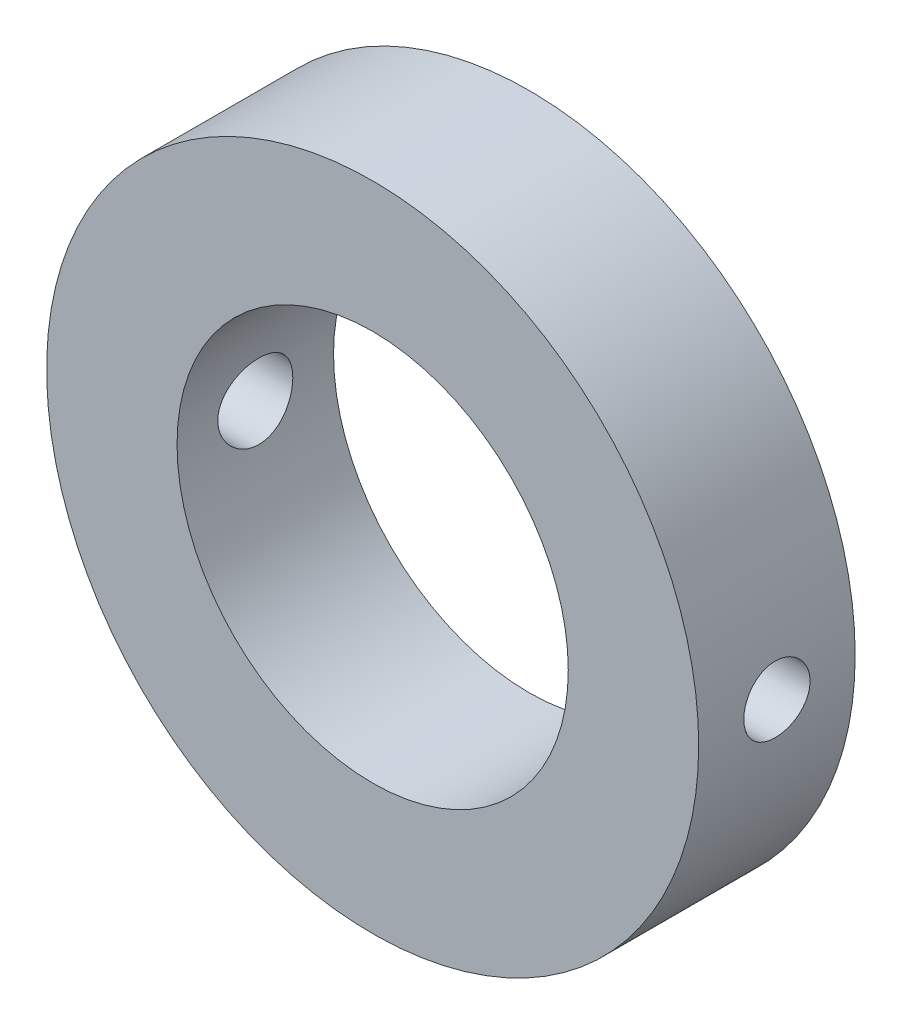
ISO-10303-21;
HEADER;
FILE_DESCRIPTION(('STEP AP214'),'2;1');
FILE_NAME('part.step','',(''),(''),'','','');
FILE_SCHEMA(('AUTOMOTIVE_DESIGN { 1 0 10303 214 1 1 1 1 }'));
ENDSEC;
DATA;
#1=APPLICATION_CONTEXT('core data for automotive mechanical design processes');
#2=APPLICATION_PROTOCOL_DEFINITION('international standard','automotive_design',2000,#1);
#3=PRODUCT_CONTEXT('',#1,'mechanical');
#4=PRODUCT('Part','Part','',(#3));
#5=PRODUCT_RELATED_PRODUCT_CATEGORY('part','',(#4));
#6=PRODUCT_DEFINITION_FORMATION('','',#4);
#7=PRODUCT_DEFINITION_CONTEXT('part definition',#1,'design');
#8=PRODUCT_DEFINITION('design','',#6,#7);
#9=PRODUCT_DEFINITION_SHAPE('','',#8);
#10=(LENGTH_UNIT() NAMED_UNIT(*) SI_UNIT(.MILLI.,.METRE.));
#11=(NAMED_UNIT(*) PLANE_ANGLE_UNIT() SI_UNIT($,.RADIAN.));
#12=(NAMED_UNIT(*) SI_UNIT($,.STERADIAN.) SOLID_ANGLE_UNIT());
#13=UNCERTAINTY_MEASURE_WITH_UNIT(LENGTH_MEASURE(1.E-05),#10,'distance_accuracy_value','');
#14=(GEOMETRIC_REPRESENTATION_CONTEXT(3) GLOBAL_UNCERTAINTY_ASSIGNED_CONTEXT((#13)) GLOBAL_UNIT_ASSIGNED_CONTEXT((#10,
#11,#12)) REPRESENTATION_CONTEXT('',''));
#15=CARTESIAN_POINT('',(0.,0.,0.));
#16=DIRECTION('',(0.,0.,1.));
#17=DIRECTION('',(1.,0.,0.));
#18=AXIS2_PLACEMENT_3D('',#15,#16,#17);
#19=CARTESIAN_POINT('',(0.,0.,6.));
#20=DIRECTION('',(0.,0.,1.));
#21=DIRECTION('',(1.,0.,0.));
#22=AXIS2_PLACEMENT_3D('',#19,#20,#21);
#23=PLANE('',#22);
#24=CARTESIAN_POINT('',(0.,0.,6.));
#25=DIRECTION('',(0.,0.,1.));
#26=DIRECTION('',(1.,0.,0.));
#27=AXIS2_PLACEMENT_3D('',#24,#25,#26);
#28=CIRCLE('',#27,25.);
#29=CARTESIAN_POINT('',(25.,0.,6.));
#30=VERTEX_POINT('',#29);
#31=EDGE_CURVE('E10',#30,#30,#28,.T.);
#32=ORIENTED_EDGE('',*,*,#31,.T.);
#33=EDGE_LOOP('',(#32));
#34=FACE_BOUND('',#33,.T.);
#35=CARTESIAN_POINT('',(0.,0.,6.));
#36=DIRECTION('',(0.,0.,1.));
#37=DIRECTION('',(1.,0.,0.));
#38=AXIS2_PLACEMENT_3D('',#35,#36,#37);
#39=CIRCLE('',#38,15.);
#40=CARTESIAN_POINT('',(15.,0.,6.));
#41=VERTEX_POINT('',#40);
#42=EDGE_CURVE('E58',#41,#41,#39,.T.);
#43=ORIENTED_EDGE('',*,*,#42,.F.);
#44=EDGE_LOOP('',(#43));
#45=FACE_BOUND('',#44,.T.);
#46=ADVANCED_FACE('F37',(#34,#45),#23,.T.);
#47=CARTESIAN_POINT('',(0.,0.,-6.));
#48=DIRECTION('',(0.,0.,1.));
#49=DIRECTION('',(1.,0.,0.));
#50=AXIS2_PLACEMENT_3D('',#47,#48,#49);
#51=PLANE('',#50);
#52=CARTESIAN_POINT('',(0.,0.,-6.));
#53=DIRECTION('',(0.,0.,1.));
#54=DIRECTION('',(1.,0.,0.));
#55=AXIS2_PLACEMENT_3D('',#52,#53,#54);
#56=CIRCLE('',#55,25.);
#57=CARTESIAN_POINT('',(25.,0.,-6.));
#58=VERTEX_POINT('',#57);
#59=EDGE_CURVE('E52',#58,#58,#56,.T.);
#60=ORIENTED_EDGE('',*,*,#59,.F.);
#61=EDGE_LOOP('',(#60));
#62=FACE_BOUND('',#61,.T.);
#63=CARTESIAN_POINT('',(0.,0.,-6.));
#64=DIRECTION('',(0.,0.,1.));
#65=DIRECTION('',(1.,0.,0.));
#66=AXIS2_PLACEMENT_3D('',#63,#64,#65);
#67=CIRCLE('',#66,15.);
#68=CARTESIAN_POINT('',(15.,0.,-6.));
#69=VERTEX_POINT('',#68);
#70=EDGE_CURVE('E61',#69,#69,#67,.T.);
#71=ORIENTED_EDGE('',*,*,#70,.T.);
#72=EDGE_LOOP('',(#71));
#73=FACE_BOUND('',#72,.T.);
#74=ADVANCED_FACE('F102',(#62,#73),#51,.F.);
#75=CARTESIAN_POINT('',(0.,0.,6.));
#76=DIRECTION('',(0.,0.,-1.));
#77=DIRECTION('',(-1.,0.,0.));
#78=AXIS2_PLACEMENT_3D('',#75,#76,#77);
#79=CYLINDRICAL_SURFACE('',#78,25.);
#80=CARTESIAN_POINT('',(-24.9096871206381,-2.12308444295476,-2.05907654032618));
#81=CARTESIAN_POINT('',(-24.919529136696,-2.00760062896075,-2.17825854002279));
#82=CARTESIAN_POINT('',(-24.9294231944101,-1.88199350189029,-2.28777337634594));
#83=CARTESIAN_POINT('',(-24.9482042220286,-1.61404473534747,-2.4842906335207));
#84=CARTESIAN_POINT('',(-24.957090130476,-1.47168577359539,-2.57126944812644));
#85=CARTESIAN_POINT('',(-24.9728482063839,-1.17430320764623,-2.72011772755873));
#86=CARTESIAN_POINT('',(-24.9797207161418,-1.01928176193229,-2.78199146118296));
#87=CARTESIAN_POINT('',(-24.9906770811245,-0.700992633340204,-2.87881072622488));
#88=CARTESIAN_POINT('',(-24.9947616418055,-0.537727047778476,-2.91376307005725));
#89=CARTESIAN_POINT('',(-24.9996715226033,-0.208364922568657,-2.95562726251991));
#90=CARTESIAN_POINT('',(-25.0005119485506,-0.0422851293176995,-2.96266907649958));
#91=CARTESIAN_POINT('',(-24.9988808596118,0.288697010660408,-2.94885913144654));
#92=CARTESIAN_POINT('',(-24.996409294656,0.453599339549097,-2.92800695072034));
#93=CARTESIAN_POINT('',(-24.9884454382992,0.776968624578638,-2.85914725100617));
#94=CARTESIAN_POINT('',(-24.9829633671137,0.935455416699539,-2.81123159284181));
#95=CARTESIAN_POINT('',(-24.9695948209692,1.24214199147886,-2.68970794863401));
#96=CARTESIAN_POINT('',(-24.9617082803375,1.3903414930266,-2.6160992608335));
#97=CARTESIAN_POINT('',(-24.9443631148393,1.67299632200475,-2.44489319668916));
#98=CARTESIAN_POINT('',(-24.9348974597172,1.80738563732034,-2.3471875655095));
#99=CARTESIAN_POINT('',(-24.9154723171328,2.05792588022678,-2.13070900198246));
#100=CARTESIAN_POINT('',(-24.9055128115564,2.17407613816799,-2.01193529645847));
#101=CARTESIAN_POINT('',(-24.886154070888,2.38551921537092,-1.7558882897559));
#102=CARTESIAN_POINT('',(-24.876758346022,2.48068960067984,-1.6185135754559));
#103=CARTESIAN_POINT('',(-24.8596535010239,2.64662320526646,-1.32964176962434));
#104=CARTESIAN_POINT('',(-24.8519443621771,2.71738669537259,-1.17814483482216));
#105=CARTESIAN_POINT('',(-24.839103338811,2.8323681024087,-0.865554433631071));
#106=CARTESIAN_POINT('',(-24.8339674366271,2.87662742225106,-0.704476369261927));
#107=CARTESIAN_POINT('',(-24.8268453138951,2.93746554311681,-0.377109407552719));
#108=CARTESIAN_POINT('',(-24.8248589619131,2.9540454992296,-0.210820727952242));
#109=CARTESIAN_POINT('',(-24.82426669997,2.95901809102679,0.121194728449837));
#110=CARTESIAN_POINT('',(-24.8256408404083,2.94757707293434,0.286919000962564));
#111=CARTESIAN_POINT('',(-24.831570474886,2.89719532972452,0.614072337783098));
#112=CARTESIAN_POINT('',(-24.8361259608843,2.85825467411292,0.775501412946012));
#113=CARTESIAN_POINT('',(-24.8478963272643,2.75404693033872,1.08940158040268));
#114=CARTESIAN_POINT('',(-24.8551094931506,2.68879681211363,1.2418783745426));
#115=CARTESIAN_POINT('',(-24.8713834121096,2.53383694584707,1.5337432551474));
#116=CARTESIAN_POINT('',(-24.8804442362997,2.44412625626122,1.67313083750029));
#117=CARTESIAN_POINT('',(-24.8994561640203,2.24218531137535,1.93570946152678));
#118=CARTESIAN_POINT('',(-24.9094120238473,2.12983026220335,2.05880419424293));
#119=CARTESIAN_POINT('',(-24.9290534300422,1.88605833376407,2.28442685420764));
#120=CARTESIAN_POINT('',(-24.9387389709237,1.75464106795217,2.3869543642925));
#121=CARTESIAN_POINT('',(-24.9567811862537,1.47600410375624,2.56880736488884));
#122=CARTESIAN_POINT('',(-24.9651340048757,1.32874054588581,2.64806607067913));
#123=CARTESIAN_POINT('',(-24.9795343619568,1.02287628850482,2.78068945960644));
#124=CARTESIAN_POINT('',(-24.9855819790935,0.864275976141961,2.83405502650427));
#125=CARTESIAN_POINT('',(-24.9946644789931,0.54105841409637,2.91312101611004));
#126=CARTESIAN_POINT('',(-24.9977138898361,0.376474227112156,2.93895489775916));
#127=CARTESIAN_POINT('',(-25.0005073175881,0.0452793671742188,2.96264598181631));
#128=CARTESIAN_POINT('',(-25.0002514549101,-0.121331231735227,2.96050420339374));
#129=CARTESIAN_POINT('',(-24.9964740643332,-0.450890797254461,2.9283992844933));
#130=CARTESIAN_POINT('',(-24.9929703145124,-0.613854755527044,2.89858760065169));
#131=CARTESIAN_POINT('',(-24.9831134300341,-0.93244843642779,2.81223830408649));
#132=CARTESIAN_POINT('',(-24.9767602582676,-1.08807806350971,2.75570034329849));
#133=CARTESIAN_POINT('',(-24.961893721853,-1.38797501808417,2.61738597397009));
#134=CARTESIAN_POINT('',(-24.953375760386,-1.53221730004641,2.53555577773188));
#135=CARTESIAN_POINT('',(-24.9351311655352,-1.80497863603253,2.34901934567631));
#136=CARTESIAN_POINT('',(-24.925404478141,-1.93349698694314,2.24431208746818));
#137=CARTESIAN_POINT('',(-24.9057556689935,-2.17204553494269,2.01418749360787));
#138=CARTESIAN_POINT('',(-24.8958326865432,-2.28194974048035,1.88863959338409));
#139=CARTESIAN_POINT('',(-24.8769694482901,-2.47916017922301,1.62082990038097));
#140=CARTESIAN_POINT('',(-24.8680292017548,-2.56646619932984,1.47856795000853));
#141=CARTESIAN_POINT('',(-24.8521339672286,-2.71608758906025,1.1811275914517));
#142=CARTESIAN_POINT('',(-24.8451814647467,-2.7783717099419,1.02593332275922));
#143=CARTESIAN_POINT('',(-24.8340738907015,-2.87597063812719,0.70719541286115));
#144=CARTESIAN_POINT('',(-24.8299186150151,-2.91128741335462,0.543652381830216));
#145=CARTESIAN_POINT('',(-24.8248986140596,-2.95378938715084,0.213836126453891));
#146=CARTESIAN_POINT('',(-24.8240155637028,-2.9611312571042,0.0475833597309922));
#147=CARTESIAN_POINT('',(-24.8255907878671,-2.94789481727939,-0.2838271217045));
#148=CARTESIAN_POINT('',(-24.82804970665,-2.92731112403693,-0.448984619103641));
#149=CARTESIAN_POINT('',(-24.8360156569705,-2.85893218650798,-0.772986693811224));
#150=CARTESIAN_POINT('',(-24.8415141303379,-2.81121333321586,-0.931847659810409));
#151=CARTESIAN_POINT('',(-24.8549279849223,-2.69002664819835,-1.23918329483981));
#152=CARTESIAN_POINT('',(-24.862840934368,-2.61658471285955,-1.38766823014077));
#153=CARTESIAN_POINT('',(-24.8773908944354,-2.47361410138327,-1.62464055873575));
#154=CARTESIAN_POINT('',(-24.8836183527531,-2.41043963644674,-1.71705203691227));
#155=CARTESIAN_POINT('',(-24.8964517083596,-2.27406938088396,-1.89412997654601));
#156=CARTESIAN_POINT('',(-24.903057608135,-2.20087352440728,-1.9787963871044));
#157=CARTESIAN_POINT('',(-24.9096871206381,-2.12308444295476,-2.05907654032618));
#158=B_SPLINE_CURVE_WITH_KNOTS('',3,(#80,#81,#82,#83,#84,#85,#86,#87,#88,#89,#90,#91,#92,#93,
#94,#95,#96,#97,#98,#99,#100,#101,#102,#103,#104,#105,#106,#107,#108,#109,#110,#111,#112,#113,
#114,#115,#116,#117,#118,#119,#120,#121,#122,#123,#124,#125,#126,#127,#128,#129,#130,#131,#132,
#133,#134,#135,#136,#137,#138,#139,#140,#141,#142,#143,#144,#145,#146,#147,#148,#149,#150,#151,
#152,#153,#154,#155,#156,#157),.UNSPECIFIED.,.T.,.F.,(4,2,2,2,2,2,2,2,2,2,2,2,2,2,2,2,2,2,2,2,2,
2,2,2,2,2,2,2,2,2,2,2,2,2,2,2,2,2,4),(0.,0.498333279021322,0.997186465617192,1.49595479303074,
1.9945968664127,2.49091426642701,2.98723916971145,3.4818894485218,3.97655323883718,
4.4734811187197,4.97042723911739,5.47020086271743,5.96996894045577,6.46895426591445,
6.96791876766221,7.46392835934694,7.95993669736412,8.45562561419453,8.95133361394057,
9.44985209440752,9.9483806852717,10.4483264396122,10.9482551290632,11.4457492513461,
11.9432252496825,12.4379941738316,12.9327695416839,13.4286044481498,13.9244615183342,
14.4235512181208,14.9226456240916,15.4223614036981,15.9220407133982,16.4189174575471,
16.9158900027483,17.4114703469254,17.9065531991764,18.2422247704341,18.5778985474908),.UNSPECIFIED.);
#159=CARTESIAN_POINT('',(-24.9096871206381,-2.12308444295476,-2.05907654032618));
#160=VERTEX_POINT('',#159);
#161=EDGE_CURVE('E88',#160,#160,#158,.T.);
#162=ORIENTED_EDGE('',*,*,#161,.T.);
#163=EDGE_LOOP('',(#162));
#164=FACE_BOUND('',#163,.T.);
#165=CARTESIAN_POINT('',(24.932876686007,-1.83075398684971,-1.76387443292463));
#166=CARTESIAN_POINT('',(24.9256077921206,-1.92974929443238,-1.6612044539813));
#167=CARTESIAN_POINT('',(24.9183761395272,-2.02015191017749,-1.55011677817778));
#168=CARTESIAN_POINT('',(24.9048033610163,-2.18113178103328,-1.31422886886965));
#169=CARTESIAN_POINT('',(24.8984632025442,-2.25168758024955,-1.18941399638618));
#170=CARTESIAN_POINT('',(24.887399097648,-2.37085663473162,-0.92966792036589));
#171=CARTESIAN_POINT('',(24.8826747711527,-2.41947505090354,-0.794739104916616));
#172=CARTESIAN_POINT('',(24.8753809521497,-2.49335413773189,-0.518611291293531));
#173=CARTESIAN_POINT('',(24.8728109201048,-2.51862065697226,-0.377413872408415));
#174=CARTESIAN_POINT('',(24.8701230179222,-2.54502656742735,-0.0932650260694136));
#175=CARTESIAN_POINT('',(24.8699964476585,-2.54625156053105,0.0496783642314163));
#176=CARTESIAN_POINT('',(24.8721876870246,-2.52475598866067,0.333737288522041));
#177=CARTESIAN_POINT('',(24.8745055571362,-2.50203483119742,0.47485277719741));
#178=CARTESIAN_POINT('',(24.8813147597229,-2.43338254242351,0.750963191084368));
#179=CARTESIAN_POINT('',(24.8858017669915,-2.3874975911271,0.885969714047657));
#180=CARTESIAN_POINT('',(24.8964409634998,-2.27386580855665,1.14637405771907));
#181=CARTESIAN_POINT('',(24.9025931917954,-2.20611846451699,1.27177165297181));
#182=CARTESIAN_POINT('',(24.9158997726064,-2.05037759161515,1.50993634350676));
#183=CARTESIAN_POINT('',(24.9230579536258,-1.96230584797391,1.62265207574145));
#184=CARTESIAN_POINT('',(24.9375554656901,-1.76854250897369,1.83174494911823));
#185=CARTESIAN_POINT('',(24.9448948011083,-1.66285048789486,1.92812169538399));
#186=CARTESIAN_POINT('',(24.9589620443144,-1.43635456504208,2.10218253912132));
#187=CARTESIAN_POINT('',(24.9656874524474,-1.31549326067594,2.1797921688835));
#188=CARTESIAN_POINT('',(24.9777372000416,-1.06239109060441,2.31361825096175));
#189=CARTESIAN_POINT('',(24.9830615560862,-0.930150359616115,2.36983495649854));
#190=CARTESIAN_POINT('',(24.9917011056226,-0.658275594753766,2.45917312348288));
#191=CARTESIAN_POINT('',(24.9950197734505,-0.518654803953977,2.49233453733719));
#192=CARTESIAN_POINT('',(24.9992879759229,-0.235793777627022,2.5347488494759));
#193=CARTESIAN_POINT('',(25.0002375793471,-0.0925536472999377,2.54400244186206));
#194=CARTESIAN_POINT('',(24.9996618504155,0.192839981023584,2.53834242070818));
#195=CARTESIAN_POINT('',(24.9981468737671,0.334995517160765,2.52352992871892));
#196=CARTESIAN_POINT('',(24.9928314295103,0.614787764665426,2.47036172400951));
#197=CARTESIAN_POINT('',(24.9890309575761,0.752424467479472,2.4320059667284));
#198=CARTESIAN_POINT('',(24.9795686345996,1.01931332406695,2.33285325021027));
#199=CARTESIAN_POINT('',(24.9739065118197,1.14856425050237,2.27205301468317));
#200=CARTESIAN_POINT('',(24.9613519903952,1.39504702578707,2.12974261751354));
#201=CARTESIAN_POINT('',(24.9544595556878,1.51227852216487,2.04823184877538));
#202=CARTESIAN_POINT('',(24.9401807945815,1.73192626942481,1.86639974112708));
#203=CARTESIAN_POINT('',(24.932792493369,1.83427742826857,1.76599991840881));
#204=CARTESIAN_POINT('',(24.9183780427508,2.02069289514225,1.54943252465604));
#205=CARTESIAN_POINT('',(24.9113518973583,2.10475700055947,1.43326477894286));
#206=CARTESIAN_POINT('',(24.89844483316,2.25232341439329,1.18823193742181));
#207=CARTESIAN_POINT('',(24.8925656367419,2.31579489194133,1.05934817621701));
#208=CARTESIAN_POINT('',(24.8826357620712,2.42016601756687,0.792678008222895));
#209=CARTESIAN_POINT('',(24.8785850311456,2.46106631586387,0.65489185801699));
#210=CARTESIAN_POINT('',(24.8727886143359,2.51897588504536,0.37492670151176));
#211=CARTESIAN_POINT('',(24.8710335915468,2.53608194789923,0.232767911104481));
#212=CARTESIAN_POINT('',(24.8699988211977,2.54621030595781,-0.0524121767264602));
#213=CARTESIAN_POINT('',(24.8707190127944,2.53923319315032,-0.195433452863121));
#214=CARTESIAN_POINT('',(24.8745448193443,2.50147373495148,-0.477721829679839));
#215=CARTESIAN_POINT('',(24.8776415869431,2.4707796784803,-0.617000875731344));
#216=CARTESIAN_POINT('',(24.8858589131073,2.38658771661036,-0.888422790308328));
#217=CARTESIAN_POINT('',(24.8909795004546,2.33308948689979,-1.02056555731439));
#218=CARTESIAN_POINT('',(24.9026814495337,2.20467748914617,-1.27430550975403));
#219=CARTESIAN_POINT('',(24.9092661045245,2.12971532919571,-1.39587804721044));
#220=CARTESIAN_POINT('',(24.9231506566266,1.96054624664385,-1.62475731538601));
#221=CARTESIAN_POINT('',(24.9304505775131,1.8663386842146,-1.73206357161608));
#222=CARTESIAN_POINT('',(24.9449859792731,1.66081715018433,-1.92990370387863));
#223=CARTESIAN_POINT('',(24.9522209813926,1.54942308768476,-2.02035443457051));
#224=CARTESIAN_POINT('',(24.9657776911329,1.3129899742744,-2.18129012942493));
#225=CARTESIAN_POINT('',(24.9720993964285,1.1879508886263,-2.25177504275711));
#226=CARTESIAN_POINT('',(24.9831201092708,0.927715467100302,-2.37078135951882));
#227=CARTESIAN_POINT('',(24.9878186982177,0.792516521934912,-2.41929709812304));
#228=CARTESIAN_POINT('',(24.9950604058288,0.515839880324976,-2.49292560075864));
#229=CARTESIAN_POINT('',(24.9976036628921,0.374362587641919,-2.5180398674639));
#230=CARTESIAN_POINT('',(25.0002418999174,0.0897919889819792,-2.54407640956366));
#231=CARTESIAN_POINT('',(25.0003473558453,-0.0532917575933871,-2.54510220069547));
#232=CARTESIAN_POINT('',(24.9981244494674,-0.337626564505905,-2.52319042256529));
#233=CARTESIAN_POINT('',(24.9957955733927,-0.478877231598289,-2.50024779473865));
#234=CARTESIAN_POINT('',(24.9889701257041,-0.755301842751776,-2.43111819259824));
#235=CARTESIAN_POINT('',(24.984476415219,-0.890483550722631,-2.38496189483576));
#236=CARTESIAN_POINT('',(24.9738265414124,-1.15107608302123,-2.27077058121458));
#237=CARTESIAN_POINT('',(24.9676721323488,-1.27649703889286,-2.20275863789975));
#238=CARTESIAN_POINT('',(24.9566173461429,-1.47429705203876,-2.0729946169276));
#239=CARTESIAN_POINT('',(24.9519868116605,-1.55037771499297,-2.01676805200823));
#240=CARTESIAN_POINT('',(24.9425242989768,-1.69581406023874,-1.89621735073665));
#241=CARTESIAN_POINT('',(24.9376923198023,-1.76516971003809,-1.83189317526391));
#242=CARTESIAN_POINT('',(24.932876686007,-1.83075398684971,-1.76387443292463));
#243=B_SPLINE_CURVE_WITH_KNOTS('',3,(#165,#166,#167,#168,#169,#170,#171,#172,#173,#174,#175,
#176,#177,#178,#179,#180,#181,#182,#183,#184,#185,#186,#187,#188,#189,#190,#191,#192,#193,#194,
#195,#196,#197,#198,#199,#200,#201,#202,#203,#204,#205,#206,#207,#208,#209,#210,#211,#212,#213,
#214,#215,#216,#217,#218,#219,#220,#221,#222,#223,#224,#225,#226,#227,#228,#229,#230,#231,#232,
#233,#234,#235,#236,#237,#238,#239,#240,#241,#242),.UNSPECIFIED.,.T.,.F.,(4,2,2,2,2,2,2,2,2,2,2,
2,2,2,2,2,2,2,2,2,2,2,2,2,2,2,2,2,2,2,2,2,2,2,2,2,2,2,4),(0.,0.428080489421893,
0.856622002722776,1.28506264632976,1.71339595601671,2.14020387091347,2.56702234638041,
2.99299324481133,3.41897413478868,3.84662250972104,4.2742812184741,4.70361000627871,
5.13293371210719,5.56151157798815,5.99007700107954,6.41684631848597,6.84361644365229,
7.27044889042678,7.69729385054462,8.12595316497807,8.55461722853135,8.98392014901777,
9.41321070171007,9.840749795959,10.2682783809578,10.6942230664805,11.1201738098201,
11.5470925538887,11.9740254935019,12.4030116818642,12.8319989623594,13.2610967957617,
13.6901670736944,14.1173931630196,14.5447094371613,14.971462496564,15.3977665136606,
15.6813679727752,15.9649708020553),.UNSPECIFIED.);
#244=CARTESIAN_POINT('',(24.932876686007,-1.83075398684971,-1.76387443292463));
#245=VERTEX_POINT('',#244);
#246=EDGE_CURVE('E82',#245,#245,#243,.T.);
#247=ORIENTED_EDGE('',*,*,#246,.T.);
#248=EDGE_LOOP('',(#247));
#249=FACE_BOUND('',#248,.T.);
#250=ORIENTED_EDGE('',*,*,#31,.F.);
#251=EDGE_LOOP('',(#250));
#252=FACE_BOUND('',#251,.T.);
#253=ORIENTED_EDGE('',*,*,#59,.T.);
#254=EDGE_LOOP('',(#253));
#255=FACE_BOUND('',#254,.T.);
#256=ADVANCED_FACE('F39',(#164,#249,#252,#255),#79,.T.);
#257=CARTESIAN_POINT('',(0.,0.,6.));
#258=DIRECTION('',(0.,0.,-1.));
#259=DIRECTION('',(-1.,0.,0.));
#260=AXIS2_PLACEMENT_3D('',#257,#258,#259);
#261=CYLINDRICAL_SURFACE('',#260,15.);
#262=CARTESIAN_POINT('',(-14.8531015544047,-2.09412850955743,-1.96804811937098));
#263=CARTESIAN_POINT('',(-14.868645066862,-1.98387403736207,-2.08554750729136));
#264=CARTESIAN_POINT('',(-14.8843360911311,-1.86367574473331,-2.19380443641481));
#265=CARTESIAN_POINT('',(-14.9142688351338,-1.60664765110796,-2.38877758989045));
#266=CARTESIAN_POINT('',(-14.9285093870021,-1.46980463990215,-2.47547653626281));
#267=CARTESIAN_POINT('',(-14.953951456913,-1.18321889871137,-2.6247884460209));
#268=CARTESIAN_POINT('',(-14.9651520894378,-1.03347242669415,-2.68739439341645));
#269=CARTESIAN_POINT('',(-14.983244725345,-0.725370442810656,-2.78654629343026));
#270=CARTESIAN_POINT('',(-14.9901378699031,-0.567017223210457,-2.82309914861281));
#271=CARTESIAN_POINT('',(-14.9987844062288,-0.248178728479443,-2.86872811813969));
#272=CARTESIAN_POINT('',(-15.0005977084198,-0.0877409218155525,-2.87812455092772));
#273=CARTESIAN_POINT('',(-14.9990533730523,0.232430209842853,-2.87005181832209));
#274=CARTESIAN_POINT('',(-14.9956958652568,0.392163552415213,-2.85258332711143));
#275=CARTESIAN_POINT('',(-14.98424060779,0.704837313115965,-2.79163216691667));
#276=CARTESIAN_POINT('',(-14.976187622913,0.857827399509803,-2.74839508032552));
#277=CARTESIAN_POINT('',(-14.9562533894361,1.15437911288915,-2.6374243434957));
#278=CARTESIAN_POINT('',(-14.9443719021533,1.29794015136081,-2.56968916592268));
#279=CARTESIAN_POINT('',(-14.9179150023353,1.57326577821594,-2.41082117054067));
#280=CARTESIAN_POINT('',(-14.9033120819344,1.70488744506692,-2.31944536453163));
#281=CARTESIAN_POINT('',(-14.8730850497422,1.95109038175582,-2.11619449852211));
#282=CARTESIAN_POINT('',(-14.8574608340404,2.06566991376453,-2.00431735054125));
#283=CARTESIAN_POINT('',(-14.8266615737697,2.27632043986042,-1.76123185040587));
#284=CARTESIAN_POINT('',(-14.8114968708268,2.37208590930986,-1.62975716395423));
#285=CARTESIAN_POINT('',(-14.7835933759223,2.54020818889804,-1.35236862598748));
#286=CARTESIAN_POINT('',(-14.7708545303586,2.61256551629207,-1.20645509362405));
#287=CARTESIAN_POINT('',(-14.7493162703097,2.73154486707986,-0.904709708799484));
#288=CARTESIAN_POINT('',(-14.7405051852836,2.77824322836016,-0.748908832039676));
#289=CARTESIAN_POINT('',(-14.7278126724101,2.84476688253164,-0.431482651070742));
#290=CARTESIAN_POINT('',(-14.72393066341,2.86459534348196,-0.269858035808809));
#291=CARTESIAN_POINT('',(-14.7215807221218,2.87664662410308,0.0518437340229614));
#292=CARTESIAN_POINT('',(-14.7230267066871,2.86930836107821,0.21190396135714));
#293=CARTESIAN_POINT('',(-14.7309705424844,2.82823901592817,0.528467111738611));
#294=CARTESIAN_POINT('',(-14.7374683224007,2.79450830638213,0.684970084971155));
#295=CARTESIAN_POINT('',(-14.7547343554624,2.7018524322937,0.989506809478562));
#296=CARTESIAN_POINT('',(-14.7654886032867,2.64300984572784,1.13756653224623));
#297=CARTESIAN_POINT('',(-14.7900571001563,2.50186315471526,1.42176970819677));
#298=CARTESIAN_POINT('',(-14.8038716371661,2.41955684218924,1.55791203830377));
#299=CARTESIAN_POINT('',(-14.8332584907073,2.23238027151047,1.8165835756236));
#300=CARTESIAN_POINT('',(-14.8488537420685,2.12719490645307,1.93888219864791));
#301=CARTESIAN_POINT('',(-14.879901636952,1.89786454898228,2.16421507215676));
#302=CARTESIAN_POINT('',(-14.8953542708296,1.77371828413889,2.26724802872607));
#303=CARTESIAN_POINT('',(-14.9245503532648,1.50855062697824,2.45206930673025));
#304=CARTESIAN_POINT('',(-14.9382763599279,1.36738150416774,2.53364870684858));
#305=CARTESIAN_POINT('',(-14.9622975630727,1.07304450103129,2.67185734618441));
#306=CARTESIAN_POINT('',(-14.9725930323269,0.919877575883779,2.72848856922276));
#307=CARTESIAN_POINT('',(-14.9884922018613,0.607661249282789,2.81456105364724));
#308=CARTESIAN_POINT('',(-14.9941461579753,0.448694864852809,2.8442939254722));
#309=CARTESIAN_POINT('',(-15.0003116312796,0.127934940114474,2.876673382834));
#310=CARTESIAN_POINT('',(-15.0008236603069,-0.0338583171955885,2.87932266432211));
#311=CARTESIAN_POINT('',(-14.9966801574169,-0.35314290074902,2.85761871280898));
#312=CARTESIAN_POINT('',(-14.992100779869,-0.510662476273963,2.83366342170954));
#313=CARTESIAN_POINT('',(-14.9784005533038,-0.819393853825237,2.7601387971517));
#314=CARTESIAN_POINT('',(-14.9692796071051,-0.970605520798656,2.71056891558639));
#315=CARTESIAN_POINT('',(-14.9474488208151,-1.26308214604804,2.58708717273811));
#316=CARTESIAN_POINT('',(-14.9347264025298,-1.40431003615699,2.51308984502003));
#317=CARTESIAN_POINT('',(-14.9070805985094,-1.67246667412894,2.34291537035755));
#318=CARTESIAN_POINT('',(-14.8921569757752,-1.79939387966823,2.24673583447178));
#319=CARTESIAN_POINT('',(-14.8614585433592,-2.03757996238009,2.03304581370119));
#320=CARTESIAN_POINT('',(-14.8456737198307,-2.14854396494603,1.91520791684978));
#321=CARTESIAN_POINT('',(-14.8152443763591,-2.34922633876815,1.66251131898726));
#322=CARTESIAN_POINT('',(-14.8005999019122,-2.43894386265189,1.52765193943778));
#323=CARTESIAN_POINT('',(-14.7740418583992,-2.59499745617749,1.24384305720592));
#324=CARTESIAN_POINT('',(-14.7621427943221,-2.66121028969723,1.09482433623439));
#325=CARTESIAN_POINT('',(-14.742570706467,-2.76759080222061,0.787506874112471));
#326=CARTESIAN_POINT('',(-14.7348971297456,-2.80776188914554,0.629209350178861));
#327=CARTESIAN_POINT('',(-14.7247656019743,-2.86041873879113,0.31019017065939));
#328=CARTESIAN_POINT('',(-14.7222361997263,-2.87328388503569,0.149533392139397));
#329=CARTESIAN_POINT('',(-14.722477834942,-2.8720459973539,-0.171693028438871));
#330=CARTESIAN_POINT('',(-14.7252493547154,-2.8579405094772,-0.332262661238454));
#331=CARTESIAN_POINT('',(-14.7357093106955,-2.80350055547229,-0.646997053674475));
#332=CARTESIAN_POINT('',(-14.7433468627673,-2.7634374556448,-0.801210714945115));
#333=CARTESIAN_POINT('',(-14.7626153323032,-2.6585727777894,-1.10062437813273));
#334=CARTESIAN_POINT('',(-14.774243456771,-2.59378849854284,-1.24583060063931));
#335=CARTESIAN_POINT('',(-14.7970917400347,-2.45957583837265,-1.49028827805799));
#336=CARTESIAN_POINT('',(-14.8077501041085,-2.39492396576028,-1.59225088032938));
#337=CARTESIAN_POINT('',(-14.8299453359107,-2.25341003905344,-1.78721346208878));
#338=CARTESIAN_POINT('',(-14.8414822296885,-2.17654762282875,-1.88021317563136));
#339=CARTESIAN_POINT('',(-14.8531015544047,-2.09412850955743,-1.96804811937098));
#340=B_SPLINE_CURVE_WITH_KNOTS('',3,(#262,#263,#264,#265,#266,#267,#268,#269,#270,#271,#272,
#273,#274,#275,#276,#277,#278,#279,#280,#281,#282,#283,#284,#285,#286,#287,#288,#289,#290,#291,
#292,#293,#294,#295,#296,#297,#298,#299,#300,#301,#302,#303,#304,#305,#306,#307,#308,#309,#310,
#311,#312,#313,#314,#315,#316,#317,#318,#319,#320,#321,#322,#323,#324,#325,#326,#327,#328,#329,
#330,#331,#332,#333,#334,#335,#336,#337,#338,#339),.UNSPECIFIED.,.T.,.F.,(4,2,2,2,2,2,2,2,2,2,2,
2,2,2,2,2,2,2,2,2,2,2,2,2,2,2,2,2,2,2,2,2,2,2,2,2,2,2,4),(0.,0.485195951158892,
0.970779525737657,1.45650439764007,1.94210053262879,2.42194505582821,2.9017775373878,
3.37710859916264,3.85246930057905,4.33292477516271,4.81342920945482,5.30118752044142,
5.78893505258014,6.27522352160331,6.76145465045416,7.23986455818806,7.71826771238629,
8.19510966140238,8.67199649896684,9.15592204705311,9.63988008474565,10.1283897862653,
10.6168606356183,11.0999701055678,11.5830314854278,12.0589635619208,12.5349058229398,
13.012531273326,13.4902081862371,13.9758098337511,14.4614308452352,14.9495616374199,
15.4376285380644,15.918868703428,16.4001526569968,16.8764846239453,17.3524838843987,
17.7151742415481,18.0778753570774),.UNSPECIFIED.);
#341=CARTESIAN_POINT('',(-14.8531015544047,-2.09412850955743,-1.96804811937098));
#342=VERTEX_POINT('',#341);
#343=EDGE_CURVE('E42',#342,#342,#340,.T.);
#344=ORIENTED_EDGE('',*,*,#343,.F.);
#345=EDGE_LOOP('',(#344));
#346=FACE_BOUND('',#345,.T.);
#347=CARTESIAN_POINT('',(14.8764436559042,-1.92130792761263,-1.79014175346472));
#348=CARTESIAN_POINT('',(14.863497015221,-2.02155395047468,-1.68270155743313));
#349=CARTESIAN_POINT('',(14.8506781872973,-2.11282291989803,-1.56676651281213));
#350=CARTESIAN_POINT('',(14.8267345146408,-2.27479322818418,-1.32106280886612));
#351=CARTESIAN_POINT('',(14.8156110723299,-2.34547758300463,-1.19128284625324));
#352=CARTESIAN_POINT('',(14.7963336830207,-2.46417186522005,-0.921473049072964));
#353=CARTESIAN_POINT('',(14.7881804577412,-2.51217628256576,-0.781440733249094));
#354=CARTESIAN_POINT('',(14.775802048459,-2.58399270850043,-0.495166625841619));
#355=CARTESIAN_POINT('',(14.7715758571908,-2.60781092088151,-0.348926436616808));
#356=CARTESIAN_POINT('',(14.7675701154154,-2.63040014627768,-0.0560263175910023));
#357=CARTESIAN_POINT('',(14.7677439029829,-2.62943399684324,0.0906127294828588));
#358=CARTESIAN_POINT('',(14.7724025096584,-2.60313229424208,0.381618022787059));
#359=CARTESIAN_POINT('',(14.7768873521636,-2.57779660881475,0.525984256677854));
#360=CARTESIAN_POINT('',(14.7896150294332,-2.50373240490485,0.807622686996721));
#361=CARTESIAN_POINT('',(14.7978388885513,-2.45512194140149,0.944926853703197));
#362=CARTESIAN_POINT('',(14.8171099429971,-2.3359954359037,1.20946321098715));
#363=CARTESIAN_POINT('',(14.828157343318,-2.26547780333734,1.33669466939281));
#364=CARTESIAN_POINT('',(14.8519968499819,-2.10355498115341,1.57913268115044));
#365=CARTESIAN_POINT('',(14.8648082467858,-2.01191001123913,1.69417717638254));
#366=CARTESIAN_POINT('',(14.8906503342614,-1.81074412403333,1.90738038798427));
#367=CARTESIAN_POINT('',(14.90368104039,-1.70122194198569,2.00553790864405));
#368=CARTESIAN_POINT('',(14.9286622466749,-1.46600003553865,2.18324225617224));
#369=CARTESIAN_POINT('',(14.940599641949,-1.34013919329326,2.26257787571746));
#370=CARTESIAN_POINT('',(14.961892224286,-1.07667279731421,2.39897255566226));
#371=CARTESIAN_POINT('',(14.9712475260844,-0.939067765790103,2.45603260592474));
#372=CARTESIAN_POINT('',(14.9862710913651,-0.656889385174294,2.54588091525587));
#373=CARTESIAN_POINT('',(14.9919617279946,-0.512364221197431,2.5788166288517));
#374=CARTESIAN_POINT('',(14.9991040508963,-0.219737854551784,2.61996287226689));
#375=CARTESIAN_POINT('',(15.0005561003713,-0.0716369593827217,2.62817552059862));
#376=CARTESIAN_POINT('',(14.9990672826395,0.221970165758317,2.6196751060815));
#377=CARTESIAN_POINT('',(14.9961809056641,0.367485737405363,2.6032712286437));
#378=CARTESIAN_POINT('',(14.9864352715899,0.653654394535295,2.54661167647604));
#379=CARTESIAN_POINT('',(14.9795759858492,0.794307444955069,2.50635582979017));
#380=CARTESIAN_POINT('',(14.9626304785006,1.06694806972508,2.40315382954714));
#381=CARTESIAN_POINT('',(14.9525414845723,1.19892808156412,2.34018817641814));
#382=CARTESIAN_POINT('',(14.9302368958771,1.45051644022264,2.19337571665836));
#383=CARTESIAN_POINT('',(14.9180211209643,1.57012373765991,2.10952714091045));
#384=CARTESIAN_POINT('',(14.8926235728395,1.79520916920173,1.92204934537602));
#385=CARTESIAN_POINT('',(14.8794314106296,1.90048617782709,1.81817997827312));
#386=CARTESIAN_POINT('',(14.8536914989336,2.09218236059076,1.59421721928268));
#387=CARTESIAN_POINT('',(14.8411437739895,2.17860081694806,1.47412321014575));
#388=CARTESIAN_POINT('',(14.8180532316764,2.33050478658645,1.22037033466494));
#389=CARTESIAN_POINT('',(14.8075203986353,2.3958870968255,1.08664870563356));
#390=CARTESIAN_POINT('',(14.7897619836728,2.50318175512286,0.80989379029324));
#391=CARTESIAN_POINT('',(14.7825361100927,2.54509617301395,0.666861326428425));
#392=CARTESIAN_POINT('',(14.7723092147309,2.60379863261624,0.377336990097996));
#393=CARTESIAN_POINT('',(14.7692594903382,2.62087646907281,0.230905611069657));
#394=CARTESIAN_POINT('',(14.7675857823818,2.63029210546998,-0.0627701374755429));
#395=CARTESIAN_POINT('',(14.7689614868753,2.6226316491803,-0.210014448959489));
#396=CARTESIAN_POINT('',(14.7759369876449,2.58303588047687,-0.499466891123229));
#397=CARTESIAN_POINT('',(14.7814910398487,2.55136341984788,-0.641712222009974));
#398=CARTESIAN_POINT('',(14.7961335704215,2.46502197669914,-0.918847866265105));
#399=CARTESIAN_POINT('',(14.805222205505,2.41035197451754,-1.05373785321366));
#400=CARTESIAN_POINT('',(14.8259853057718,2.27916200300675,-1.31337820645706));
#401=CARTESIAN_POINT('',(14.8376770096612,2.20249533616928,-1.43805301955988));
#402=CARTESIAN_POINT('',(14.862309648409,2.0296190903342,-1.67288974746059));
#403=CARTESIAN_POINT('',(14.8752506973029,1.93340772648376,-1.78305033528057));
#404=CARTESIAN_POINT('',(14.9011450901288,1.72258124781932,-1.987336585135));
#405=CARTESIAN_POINT('',(14.9140960836922,1.60772796488465,-2.08121692941071));
#406=CARTESIAN_POINT('',(14.9383789501214,1.36375892920595,-2.24841072018709));
#407=CARTESIAN_POINT('',(14.9497108193987,1.23464314485304,-2.3217241211056));
#408=CARTESIAN_POINT('',(14.9694887563104,0.965696997064847,-2.44567283639274));
#409=CARTESIAN_POINT('',(14.977934144778,0.825864121442877,-2.49630281439687));
#410=CARTESIAN_POINT('',(14.9909791056957,0.539507107878044,-2.57331073744583));
#411=CARTESIAN_POINT('',(14.9955791289534,0.392983756411163,-2.59969152535671));
#412=CARTESIAN_POINT('',(15.0003797368507,0.0994137305237418,-2.62720065536609));
#413=CARTESIAN_POINT('',(15.0006359407946,-0.0476021788926837,-2.62864825185301));
#414=CARTESIAN_POINT('',(14.9968627187035,-0.339791901899296,-2.60706036240708));
#415=CARTESIAN_POINT('',(14.9928327039392,-0.484965459663274,-2.58402151316375));
#416=CARTESIAN_POINT('',(14.9809661874252,-0.768581630708984,-2.51435202882964));
#417=CARTESIAN_POINT('',(14.9731488067386,-0.907054252736511,-2.46783985356937));
#418=CARTESIAN_POINT('',(14.9545734224045,-1.17415746167449,-2.35267697558967));
#419=CARTESIAN_POINT('',(14.9438176562003,-1.30279544220298,-2.28404311038157));
#420=CARTESIAN_POINT('',(14.9235036481697,-1.51572598035857,-2.14669029654019));
#421=CARTESIAN_POINT('',(14.9143369684647,-1.60297412234608,-2.08243580107988));
#422=CARTESIAN_POINT('',(14.8955716690532,-1.76887211248068,-1.94370235753816));
#423=CARTESIAN_POINT('',(14.8859730398786,-1.84752177202732,-1.86922318526788));
#424=CARTESIAN_POINT('',(14.8764436559042,-1.92130792761263,-1.79014175346472));
#425=B_SPLINE_CURVE_WITH_KNOTS('',3,(#347,#348,#349,#350,#351,#352,#353,#354,#355,#356,#357,
#358,#359,#360,#361,#362,#363,#364,#365,#366,#367,#368,#369,#370,#371,#372,#373,#374,#375,#376,
#377,#378,#379,#380,#381,#382,#383,#384,#385,#386,#387,#388,#389,#390,#391,#392,#393,#394,#395,
#396,#397,#398,#399,#400,#401,#402,#403,#404,#405,#406,#407,#408,#409,#410,#411,#412,#413,#414,
#415,#416,#417,#418,#419,#420,#421,#422,#423,#424),.UNSPECIFIED.,.T.,.F.,(4,2,2,2,2,2,2,2,2,2,2,
2,2,2,2,2,2,2,2,2,2,2,2,2,2,2,2,2,2,2,2,2,2,2,2,2,2,2,4),(0.,0.442153971685276,0.88467173073103,
1.32729694344181,1.76980859352621,2.20762937758024,2.64545253782923,3.08107811301791,
3.5167353242344,3.95760417713962,4.39850423364868,4.84413968949656,5.28975534031866,
5.73262400456433,6.17545471844095,6.61276980234213,7.05008803901737,7.4877826725301,
7.92551439839024,8.36886629150744,8.81223505623186,9.25774693943073,9.70321952295993,
10.1434514071466,10.5836522606439,11.0191027304849,11.4545725093045,11.8930168052353,
12.3315011586104,12.7761067976851,13.2207134221242,13.6654245871699,14.1100836096256,
14.5490447490022,14.9880661892259,15.4248939057251,15.8613899210116,16.1868305258039,
16.5122782674298),.UNSPECIFIED.);
#426=CARTESIAN_POINT('',(14.8764436559042,-1.92130792761263,-1.79014175346472));
#427=VERTEX_POINT('',#426);
#428=EDGE_CURVE('E63',#427,#427,#425,.T.);
#429=ORIENTED_EDGE('',*,*,#428,.F.);
#430=EDGE_LOOP('',(#429));
#431=FACE_BOUND('',#430,.T.);
#432=ORIENTED_EDGE('',*,*,#42,.T.);
#433=EDGE_LOOP('',(#432));
#434=FACE_BOUND('',#433,.T.);
#435=ORIENTED_EDGE('',*,*,#70,.F.);
#436=EDGE_LOOP('',(#435));
#437=FACE_BOUND('',#436,.T.);
#438=ADVANCED_FACE('F69',(#346,#431,#434,#437),#261,.F.);
#439=CARTESIAN_POINT('',(30.,0.,0.));
#440=DIRECTION('',(-1.,0.,0.));
#441=DIRECTION('',(0.,-1.,0.));
#442=AXIS2_PLACEMENT_3D('',#439,#440,#441);
#443=CONICAL_SURFACE('',#442,2.5,0.00833314044013593);
#444=ORIENTED_EDGE('',*,*,#428,.T.);
#445=EDGE_LOOP('',(#444));
#446=FACE_BOUND('',#445,.T.);
#447=ORIENTED_EDGE('',*,*,#246,.F.);
#448=EDGE_LOOP('',(#447));
#449=FACE_BOUND('',#448,.T.);
#450=ADVANCED_FACE('F75',(#446,#449),#443,.F.);
#451=ORIENTED_EDGE('',*,*,#343,.T.);
#452=EDGE_LOOP('',(#451));
#453=FACE_BOUND('',#452,.T.);
#454=ORIENTED_EDGE('',*,*,#161,.F.);
#455=EDGE_LOOP('',(#454));
#456=FACE_BOUND('',#455,.T.);
#457=ADVANCED_FACE('F72',(#453,#456),#443,.F.);
#458=CLOSED_SHELL('',(#46,#74,#256,#438,#450,#457));
#459=MANIFOLD_SOLID_BREP('B2',#458);
#460=ADVANCED_BREP_SHAPE_REPRESENTATION('',(#18,#459),#14);
#461=SHAPE_DEFINITION_REPRESENTATION(#9,#460);
ENDSEC;
END-ISO-10303-21;
